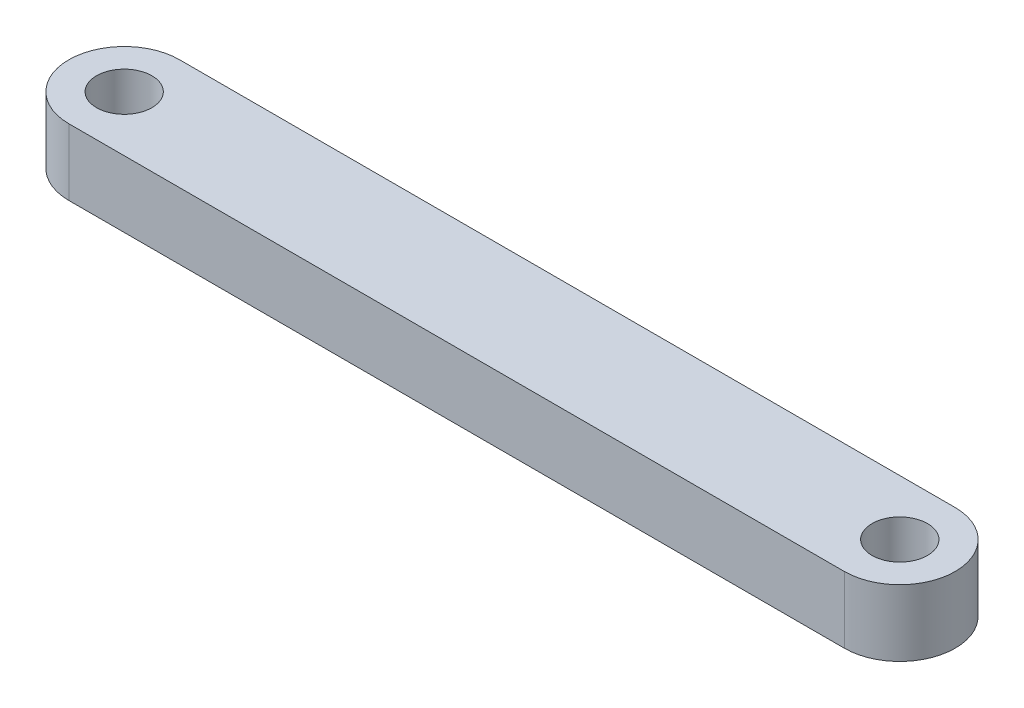
ISO-10303-21;
HEADER;
FILE_DESCRIPTION(('STEP AP214'),'2;1');
FILE_NAME('part.step','',(''),(''),'','','');
FILE_SCHEMA(('AUTOMOTIVE_DESIGN { 1 0 10303 214 1 1 1 1 }'));
ENDSEC;
DATA;
#1=APPLICATION_CONTEXT('core data for automotive mechanical design processes');
#2=APPLICATION_PROTOCOL_DEFINITION('international standard','automotive_design',2000,#1);
#3=PRODUCT_CONTEXT('',#1,'mechanical');
#4=PRODUCT('Part','Part','',(#3));
#5=PRODUCT_RELATED_PRODUCT_CATEGORY('part','',(#4));
#6=PRODUCT_DEFINITION_FORMATION('','',#4);
#7=PRODUCT_DEFINITION_CONTEXT('part definition',#1,'design');
#8=PRODUCT_DEFINITION('design','',#6,#7);
#9=PRODUCT_DEFINITION_SHAPE('','',#8);
#10=(LENGTH_UNIT() NAMED_UNIT(*) SI_UNIT(.MILLI.,.METRE.));
#11=(NAMED_UNIT(*) PLANE_ANGLE_UNIT() SI_UNIT($,.RADIAN.));
#12=(NAMED_UNIT(*) SI_UNIT($,.STERADIAN.) SOLID_ANGLE_UNIT());
#13=UNCERTAINTY_MEASURE_WITH_UNIT(LENGTH_MEASURE(1.E-05),#10,'distance_accuracy_value','');
#14=(GEOMETRIC_REPRESENTATION_CONTEXT(3) GLOBAL_UNCERTAINTY_ASSIGNED_CONTEXT((#13)) GLOBAL_UNIT_ASSIGNED_CONTEXT((#10,
#11,#12)) REPRESENTATION_CONTEXT('',''));
#15=CARTESIAN_POINT('',(0.,0.,0.));
#16=DIRECTION('',(0.,0.,1.));
#17=DIRECTION('',(1.,0.,0.));
#18=AXIS2_PLACEMENT_3D('',#15,#16,#17);
#19=CARTESIAN_POINT('',(0.,3.,0.));
#20=DIRECTION('',(0.,1.,0.));
#21=DIRECTION('',(0.,0.,1.));
#22=AXIS2_PLACEMENT_3D('',#19,#20,#21);
#23=PLANE('',#22);
#24=CARTESIAN_POINT('',(0.,3.,0.));
#25=DIRECTION('',(0.,1.,0.));
#26=DIRECTION('',(0.,0.,1.));
#27=AXIS2_PLACEMENT_3D('',#24,#25,#26);
#28=CIRCLE('',#27,1.25);
#29=CARTESIAN_POINT('',(0.,3.,1.25));
#30=VERTEX_POINT('',#29);
#31=EDGE_CURVE('E104',#30,#30,#28,.T.);
#32=ORIENTED_EDGE('',*,*,#31,.F.);
#33=EDGE_LOOP('',(#32));
#34=FACE_BOUND('',#33,.T.);
#35=CARTESIAN_POINT('',(0.,3.,0.));
#36=DIRECTION('',(0.,1.,0.));
#37=DIRECTION('',(0.,0.,1.));
#38=AXIS2_PLACEMENT_3D('',#35,#36,#37);
#39=CIRCLE('',#38,2.5);
#40=CARTESIAN_POINT('',(0.,3.,-2.5));
#41=VERTEX_POINT('',#40);
#42=CARTESIAN_POINT('',(0.,3.,2.5));
#43=VERTEX_POINT('',#42);
#44=EDGE_CURVE('E89',#41,#43,#39,.T.);
#45=ORIENTED_EDGE('',*,*,#44,.T.);
#46=DIRECTION('',(1.,0.,0.));
#47=VECTOR('',#46,1.);
#48=CARTESIAN_POINT('',(0.,3.,2.5));
#49=LINE('',#48,#47);
#50=CARTESIAN_POINT('',(35.,3.,2.5));
#51=VERTEX_POINT('',#50);
#52=EDGE_CURVE('E84',#43,#51,#49,.T.);
#53=ORIENTED_EDGE('',*,*,#52,.T.);
#54=CARTESIAN_POINT('',(35.,3.,0.));
#55=DIRECTION('',(0.,1.,0.));
#56=DIRECTION('',(0.,0.,1.));
#57=AXIS2_PLACEMENT_3D('',#54,#55,#56);
#58=CIRCLE('',#57,2.5);
#59=CARTESIAN_POINT('',(35.,3.,-2.5));
#60=VERTEX_POINT('',#59);
#61=EDGE_CURVE('E87',#51,#60,#58,.T.);
#62=ORIENTED_EDGE('',*,*,#61,.T.);
#63=DIRECTION('',(-1.,0.,0.));
#64=VECTOR('',#63,1.);
#65=CARTESIAN_POINT('',(0.,3.,-2.5));
#66=LINE('',#65,#64);
#67=EDGE_CURVE('E54',#60,#41,#66,.T.);
#68=ORIENTED_EDGE('',*,*,#67,.T.);
#69=EDGE_LOOP('',(#45,#53,#62,#68));
#70=FACE_BOUND('',#69,.T.);
#71=CARTESIAN_POINT('',(35.,3.,0.));
#72=DIRECTION('',(0.,1.,0.));
#73=DIRECTION('',(0.,0.,1.));
#74=AXIS2_PLACEMENT_3D('',#71,#72,#73);
#75=CIRCLE('',#74,1.25);
#76=CARTESIAN_POINT('',(35.,3.,1.25));
#77=VERTEX_POINT('',#76);
#78=EDGE_CURVE('E119',#77,#77,#75,.T.);
#79=ORIENTED_EDGE('',*,*,#78,.F.);
#80=EDGE_LOOP('',(#79));
#81=FACE_BOUND('',#80,.T.);
#82=ADVANCED_FACE('F37',(#34,#70,#81),#23,.T.);
#83=CARTESIAN_POINT('',(0.,0.,0.));
#84=DIRECTION('',(0.,1.,0.));
#85=DIRECTION('',(0.,0.,1.));
#86=AXIS2_PLACEMENT_3D('',#83,#84,#85);
#87=PLANE('',#86);
#88=CARTESIAN_POINT('',(0.,0.,0.));
#89=DIRECTION('',(0.,1.,0.));
#90=DIRECTION('',(0.,0.,1.));
#91=AXIS2_PLACEMENT_3D('',#88,#89,#90);
#92=CIRCLE('',#91,2.5);
#93=CARTESIAN_POINT('',(0.,0.,-2.5));
#94=VERTEX_POINT('',#93);
#95=CARTESIAN_POINT('',(0.,0.,2.5));
#96=VERTEX_POINT('',#95);
#97=EDGE_CURVE('E101',#94,#96,#92,.T.);
#98=ORIENTED_EDGE('',*,*,#97,.F.);
#99=DIRECTION('',(-1.,0.,0.));
#100=VECTOR('',#99,1.);
#101=CARTESIAN_POINT('',(0.,0.,-2.5));
#102=LINE('',#101,#100);
#103=CARTESIAN_POINT('',(35.,0.,-2.5));
#104=VERTEX_POINT('',#103);
#105=EDGE_CURVE('E77',#104,#94,#102,.T.);
#106=ORIENTED_EDGE('',*,*,#105,.F.);
#107=CARTESIAN_POINT('',(35.,0.,0.));
#108=DIRECTION('',(0.,1.,0.));
#109=DIRECTION('',(0.,0.,1.));
#110=AXIS2_PLACEMENT_3D('',#107,#108,#109);
#111=CIRCLE('',#110,2.5);
#112=CARTESIAN_POINT('',(35.,0.,2.5));
#113=VERTEX_POINT('',#112);
#114=EDGE_CURVE('E71',#113,#104,#111,.T.);
#115=ORIENTED_EDGE('',*,*,#114,.F.);
#116=DIRECTION('',(1.,0.,0.));
#117=VECTOR('',#116,1.);
#118=CARTESIAN_POINT('',(0.,0.,2.5));
#119=LINE('',#118,#117);
#120=EDGE_CURVE('E93',#96,#113,#119,.T.);
#121=ORIENTED_EDGE('',*,*,#120,.F.);
#122=EDGE_LOOP('',(#98,#106,#115,#121));
#123=FACE_BOUND('',#122,.T.);
#124=CARTESIAN_POINT('',(0.,0.,0.));
#125=DIRECTION('',(0.,1.,0.));
#126=DIRECTION('',(0.,0.,1.));
#127=AXIS2_PLACEMENT_3D('',#124,#125,#126);
#128=CIRCLE('',#127,1.25);
#129=CARTESIAN_POINT('',(0.,0.,1.25));
#130=VERTEX_POINT('',#129);
#131=EDGE_CURVE('E116',#130,#130,#128,.T.);
#132=ORIENTED_EDGE('',*,*,#131,.T.);
#133=EDGE_LOOP('',(#132));
#134=FACE_BOUND('',#133,.T.);
#135=CARTESIAN_POINT('',(35.,0.,0.));
#136=DIRECTION('',(0.,1.,0.));
#137=DIRECTION('',(0.,0.,1.));
#138=AXIS2_PLACEMENT_3D('',#135,#136,#137);
#139=CIRCLE('',#138,1.25);
#140=CARTESIAN_POINT('',(35.,0.,1.25));
#141=VERTEX_POINT('',#140);
#142=EDGE_CURVE('E122',#141,#141,#139,.T.);
#143=ORIENTED_EDGE('',*,*,#142,.T.);
#144=EDGE_LOOP('',(#143));
#145=FACE_BOUND('',#144,.T.);
#146=ADVANCED_FACE('F112',(#123,#134,#145),#87,.F.);
#147=CARTESIAN_POINT('',(0.,3.,0.));
#148=DIRECTION('',(0.,-1.,0.));
#149=DIRECTION('',(0.,0.,-1.));
#150=AXIS2_PLACEMENT_3D('',#147,#148,#149);
#151=CYLINDRICAL_SURFACE('',#150,2.5);
#152=ORIENTED_EDGE('',*,*,#97,.T.);
#153=DIRECTION('',(0.,-1.,0.));
#154=VECTOR('',#153,1.);
#155=CARTESIAN_POINT('',(0.,3.,2.5));
#156=LINE('',#155,#154);
#157=EDGE_CURVE('E11',#43,#96,#156,.T.);
#158=ORIENTED_EDGE('',*,*,#157,.F.);
#159=ORIENTED_EDGE('',*,*,#44,.F.);
#160=DIRECTION('',(0.,-1.,0.));
#161=VECTOR('',#160,1.);
#162=CARTESIAN_POINT('',(0.,3.,-2.5));
#163=LINE('',#162,#161);
#164=EDGE_CURVE('E97',#41,#94,#163,.T.);
#165=ORIENTED_EDGE('',*,*,#164,.T.);
#166=EDGE_LOOP('',(#152,#158,#159,#165));
#167=FACE_BOUND('',#166,.T.);
#168=ADVANCED_FACE('F39',(#167),#151,.T.);
#169=CARTESIAN_POINT('',(0.,3.,2.5));
#170=DIRECTION('',(0.,0.,-1.));
#171=DIRECTION('',(-1.,0.,0.));
#172=AXIS2_PLACEMENT_3D('',#169,#170,#171);
#173=PLANE('',#172);
#174=ORIENTED_EDGE('',*,*,#120,.T.);
#175=DIRECTION('',(0.,-1.,0.));
#176=VECTOR('',#175,1.);
#177=CARTESIAN_POINT('',(35.,3.,2.5));
#178=LINE('',#177,#176);
#179=EDGE_CURVE('E46',#51,#113,#178,.T.);
#180=ORIENTED_EDGE('',*,*,#179,.F.);
#181=ORIENTED_EDGE('',*,*,#52,.F.);
#182=ORIENTED_EDGE('',*,*,#157,.T.);
#183=EDGE_LOOP('',(#174,#180,#181,#182));
#184=FACE_BOUND('',#183,.T.);
#185=ADVANCED_FACE('F92',(#184),#173,.F.);
#186=CARTESIAN_POINT('',(35.,3.,0.));
#187=DIRECTION('',(0.,-1.,0.));
#188=DIRECTION('',(0.,0.,-1.));
#189=AXIS2_PLACEMENT_3D('',#186,#187,#188);
#190=CYLINDRICAL_SURFACE('',#189,2.5);
#191=ORIENTED_EDGE('',*,*,#114,.T.);
#192=DIRECTION('',(0.,-1.,0.));
#193=VECTOR('',#192,1.);
#194=CARTESIAN_POINT('',(35.,3.,-2.5));
#195=LINE('',#194,#193);
#196=EDGE_CURVE('E94',#60,#104,#195,.T.);
#197=ORIENTED_EDGE('',*,*,#196,.F.);
#198=ORIENTED_EDGE('',*,*,#61,.F.);
#199=ORIENTED_EDGE('',*,*,#179,.T.);
#200=EDGE_LOOP('',(#191,#197,#198,#199));
#201=FACE_BOUND('',#200,.T.);
#202=ADVANCED_FACE('F95',(#201),#190,.T.);
#203=CARTESIAN_POINT('',(0.,3.,-2.5));
#204=DIRECTION('',(0.,0.,1.));
#205=DIRECTION('',(1.,0.,0.));
#206=AXIS2_PLACEMENT_3D('',#203,#204,#205);
#207=PLANE('',#206);
#208=ORIENTED_EDGE('',*,*,#105,.T.);
#209=ORIENTED_EDGE('',*,*,#164,.F.);
#210=ORIENTED_EDGE('',*,*,#67,.F.);
#211=ORIENTED_EDGE('',*,*,#196,.T.);
#212=EDGE_LOOP('',(#208,#209,#210,#211));
#213=FACE_BOUND('',#212,.T.);
#214=ADVANCED_FACE('F109',(#213),#207,.F.);
#215=CARTESIAN_POINT('',(0.,3.,0.));
#216=DIRECTION('',(0.,-1.,0.));
#217=DIRECTION('',(0.,0.,-1.));
#218=AXIS2_PLACEMENT_3D('',#215,#216,#217);
#219=CYLINDRICAL_SURFACE('',#218,1.25);
#220=ORIENTED_EDGE('',*,*,#31,.T.);
#221=EDGE_LOOP('',(#220));
#222=FACE_BOUND('',#221,.T.);
#223=ORIENTED_EDGE('',*,*,#131,.F.);
#224=EDGE_LOOP('',(#223));
#225=FACE_BOUND('',#224,.T.);
#226=ADVANCED_FACE('F139',(#222,#225),#219,.F.);
#227=CARTESIAN_POINT('',(35.,3.,0.));
#228=DIRECTION('',(0.,-1.,0.));
#229=DIRECTION('',(0.,0.,-1.));
#230=AXIS2_PLACEMENT_3D('',#227,#228,#229);
#231=CYLINDRICAL_SURFACE('',#230,1.25);
#232=ORIENTED_EDGE('',*,*,#78,.T.);
#233=EDGE_LOOP('',(#232));
#234=FACE_BOUND('',#233,.T.);
#235=ORIENTED_EDGE('',*,*,#142,.F.);
#236=EDGE_LOOP('',(#235));
#237=FACE_BOUND('',#236,.T.);
#238=ADVANCED_FACE('F128',(#234,#237),#231,.F.);
#239=CLOSED_SHELL('',(#82,#146,#168,#185,#202,#214,#226,#238));
#240=MANIFOLD_SOLID_BREP('B2',#239);
#241=ADVANCED_BREP_SHAPE_REPRESENTATION('',(#18,#240),#14);
#242=SHAPE_DEFINITION_REPRESENTATION(#9,#241);
ENDSEC;
END-ISO-10303-21;
